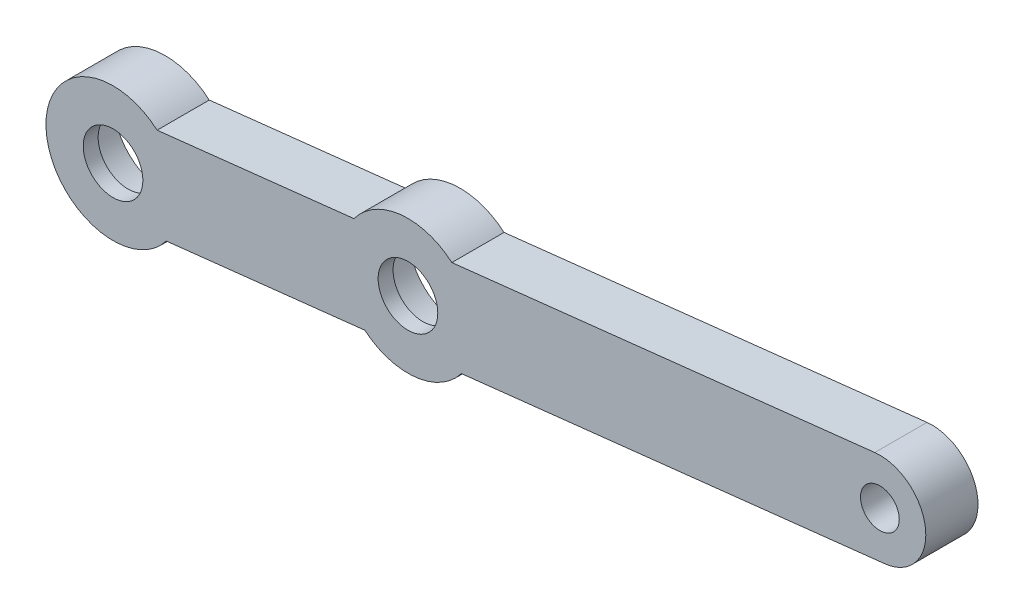
ISO-10303-21;
HEADER;
FILE_DESCRIPTION(('STEP AP214'),'2;1');
FILE_NAME('part.step','',(''),(''),'','','');
FILE_SCHEMA(('AUTOMOTIVE_DESIGN { 1 0 10303 214 1 1 1 1 }'));
ENDSEC;
DATA;
#1=APPLICATION_CONTEXT('core data for automotive mechanical design processes');
#2=APPLICATION_PROTOCOL_DEFINITION('international standard','automotive_design',2000,#1);
#3=PRODUCT_CONTEXT('',#1,'mechanical');
#4=PRODUCT('Part','Part','',(#3));
#5=PRODUCT_RELATED_PRODUCT_CATEGORY('part','',(#4));
#6=PRODUCT_DEFINITION_FORMATION('','',#4);
#7=PRODUCT_DEFINITION_CONTEXT('part definition',#1,'design');
#8=PRODUCT_DEFINITION('design','',#6,#7);
#9=PRODUCT_DEFINITION_SHAPE('','',#8);
#10=(LENGTH_UNIT() NAMED_UNIT(*) SI_UNIT(.MILLI.,.METRE.));
#11=(NAMED_UNIT(*) PLANE_ANGLE_UNIT() SI_UNIT($,.RADIAN.));
#12=(NAMED_UNIT(*) SI_UNIT($,.STERADIAN.) SOLID_ANGLE_UNIT());
#13=UNCERTAINTY_MEASURE_WITH_UNIT(LENGTH_MEASURE(1.E-05),#10,'distance_accuracy_value','');
#14=(GEOMETRIC_REPRESENTATION_CONTEXT(3) GLOBAL_UNCERTAINTY_ASSIGNED_CONTEXT((#13)) GLOBAL_UNIT_ASSIGNED_CONTEXT((#10,
#11,#12)) REPRESENTATION_CONTEXT('',''));
#15=CARTESIAN_POINT('',(0.,0.,0.));
#16=DIRECTION('',(0.,0.,1.));
#17=DIRECTION('',(1.,0.,0.));
#18=AXIS2_PLACEMENT_3D('',#15,#16,#17);
#19=CARTESIAN_POINT('',(3.22612963884084,-57.4284659291081,-1.80560142151046));
#20=DIRECTION('',(0.,0.,1.));
#21=DIRECTION('',(1.,0.,0.));
#22=AXIS2_PLACEMENT_3D('',#19,#20,#21);
#23=PLANE('',#22);
#24=CARTESIAN_POINT('',(3.22612963884084,-57.4284659291081,-1.80560142151046));
#25=DIRECTION('',(0.,0.,1.));
#26=DIRECTION('',(1.,0.,0.));
#27=AXIS2_PLACEMENT_3D('',#24,#25,#26);
#28=CIRCLE('',#27,9.24304799054226);
#29=CARTESIAN_POINT('',(4.24629093724876,-66.6150434790284,-1.80560142151046));
#30=VERTEX_POINT('',#29);
#31=CARTESIAN_POINT('',(2.2059683404333,-48.241888379188,-1.80560142151046));
#32=VERTEX_POINT('',#31);
#33=EDGE_CURVE('E113',#30,#32,#28,.T.);
#34=ORIENTED_EDGE('',*,*,#33,.F.);
#35=DIRECTION('',(0.99389049578886,0.110370659056531,0.));
#36=VECTOR('',#35,1.);
#37=CARTESIAN_POINT('',(-80.9773215388133,-76.0790501437623,-1.80560142151046));
#38=LINE('',#37,#36);
#39=CARTESIAN_POINT('',(-80.9773215388133,-76.0790501437623,-1.80560142151046));
#40=VERTEX_POINT('',#39);
#41=EDGE_CURVE('E58',#40,#30,#38,.T.);
#42=ORIENTED_EDGE('',*,*,#41,.F.);
#43=CARTESIAN_POINT('',(-91.7205093246328,-67.903848849689,-1.80560142151046));
#44=DIRECTION('',(0.,0.,1.));
#45=DIRECTION('',(1.,0.,0.));
#46=AXIS2_PLACEMENT_3D('',#43,#44,#45);
#47=CIRCLE('',#46,13.5);
#48=CARTESIAN_POINT('',(-100.408377438308,-78.23685168717,-1.80560142151046));
#49=VERTEX_POINT('',#48);
#50=EDGE_CURVE('E66',#49,#40,#47,.T.);
#51=ORIENTED_EDGE('',*,*,#50,.F.);
#52=DIRECTION('',(0.99389049578886,0.110370659056531,0.));
#53=VECTOR('',#52,1.);
#54=CARTESIAN_POINT('',(-140.340201625368,-82.6712453870084,-1.80560142151046));
#55=LINE('',#54,#53);
#56=CARTESIAN_POINT('',(-140.340201625368,-82.6712453870084,-1.80560142151046));
#57=VERTEX_POINT('',#56);
#58=EDGE_CURVE('E193',#57,#49,#55,.T.);
#59=ORIENTED_EDGE('',*,*,#58,.F.);
#60=CARTESIAN_POINT('',(-151.057184368627,-74.461721595662,-1.80560142151046));
#61=DIRECTION('',(0.,0.,1.));
#62=DIRECTION('',(1.,0.,0.));
#63=AXIS2_PLACEMENT_3D('',#60,#61,#62);
#64=CIRCLE('',#63,13.5);
#65=CARTESIAN_POINT('',(-142.195346543319,-64.2775264699818,-1.80560142151046));
#66=VERTEX_POINT('',#65);
#67=EDGE_CURVE('E190',#66,#57,#64,.T.);
#68=ORIENTED_EDGE('',*,*,#67,.F.);
#69=DIRECTION('',(-0.99389049578886,-0.110370659056534,0.));
#70=VECTOR('',#69,1.);
#71=CARTESIAN_POINT('',(-102.575568142641,-59.8777851782756,-1.80560142151046));
#72=LINE('',#71,#70);
#73=CARTESIAN_POINT('',(-102.575568142641,-59.8777851782756,-1.80560142151046));
#74=VERTEX_POINT('',#73);
#75=EDGE_CURVE('E187',#74,#66,#72,.T.);
#76=ORIENTED_EDGE('',*,*,#75,.F.);
#77=CARTESIAN_POINT('',(-91.7205093246328,-67.903848849689,-1.80560142151046));
#78=DIRECTION('',(0.,0.,1.));
#79=DIRECTION('',(1.,0.,0.));
#80=AXIS2_PLACEMENT_3D('',#77,#78,#79);
#81=CIRCLE('',#80,13.5);
#82=CARTESIAN_POINT('',(-82.8907760281091,-57.6918064529761,-1.80560142151046));
#83=VERTEX_POINT('',#82);
#84=EDGE_CURVE('E184',#83,#74,#81,.T.);
#85=ORIENTED_EDGE('',*,*,#84,.F.);
#86=DIRECTION('',(-0.99389049578886,-0.110370659056534,0.));
#87=VECTOR('',#86,1.);
#88=CARTESIAN_POINT('',(2.2059683404333,-48.241888379188,-1.80560142151046));
#89=LINE('',#88,#87);
#90=EDGE_CURVE('E181',#32,#83,#89,.T.);
#91=ORIENTED_EDGE('',*,*,#90,.F.);
#92=EDGE_LOOP('',(#34,#42,#51,#59,#68,#76,#85,#91));
#93=FACE_BOUND('',#92,.T.);
#94=CARTESIAN_POINT('',(3.22612963884084,-57.4284659291081,-1.80560142151046));
#95=DIRECTION('',(0.,0.,1.));
#96=DIRECTION('',(1.,0.,0.));
#97=AXIS2_PLACEMENT_3D('',#94,#95,#96);
#98=CIRCLE('',#97,3.9);
#99=CARTESIAN_POINT('',(7.12612963884084,-57.4284659291081,-1.80560142151046));
#100=VERTEX_POINT('',#99);
#101=EDGE_CURVE('E175',#100,#100,#98,.T.);
#102=ORIENTED_EDGE('',*,*,#101,.T.);
#103=EDGE_LOOP('',(#102));
#104=FACE_BOUND('',#103,.T.);
#105=CARTESIAN_POINT('',(-91.7205093246328,-67.903848849689,-1.80560142151046));
#106=DIRECTION('',(0.,0.,1.));
#107=DIRECTION('',(1.,0.,0.));
#108=AXIS2_PLACEMENT_3D('',#105,#106,#107);
#109=CIRCLE('',#108,10.35);
#110=CARTESIAN_POINT('',(-81.3705093246328,-67.903848849689,-1.80560142151046));
#111=VERTEX_POINT('',#110);
#112=EDGE_CURVE('E168',#111,#111,#109,.T.);
#113=ORIENTED_EDGE('',*,*,#112,.T.);
#114=EDGE_LOOP('',(#113));
#115=FACE_BOUND('',#114,.T.);
#116=CARTESIAN_POINT('',(-151.057184368627,-74.461721595662,-1.80560142151046));
#117=DIRECTION('',(0.,0.,1.));
#118=DIRECTION('',(1.,0.,0.));
#119=AXIS2_PLACEMENT_3D('',#116,#117,#118);
#120=CIRCLE('',#119,10.35);
#121=CARTESIAN_POINT('',(-140.707184368627,-74.461721595662,-1.80560142151046));
#122=VERTEX_POINT('',#121);
#123=EDGE_CURVE('E164',#122,#122,#120,.T.);
#124=ORIENTED_EDGE('',*,*,#123,.T.);
#125=EDGE_LOOP('',(#124));
#126=FACE_BOUND('',#125,.T.);
#127=ADVANCED_FACE('F42',(#93,#104,#115,#126),#23,.F.);
#128=CARTESIAN_POINT('',(3.22612963884084,-57.4284659291081,5.69439857848954));
#129=DIRECTION('',(0.,0.,-1.));
#130=DIRECTION('',(-1.,0.,0.));
#131=AXIS2_PLACEMENT_3D('',#128,#129,#130);
#132=CYLINDRICAL_SURFACE('',#131,9.24304799054226);
#133=ORIENTED_EDGE('',*,*,#33,.T.);
#134=DIRECTION('',(0.,0.,-1.));
#135=VECTOR('',#134,1.);
#136=CARTESIAN_POINT('',(2.2059683404333,-48.241888379188,5.69439857848954));
#137=LINE('',#136,#135);
#138=CARTESIAN_POINT('',(2.20596834043328,-48.2418883791878,8.69439857848954));
#139=VERTEX_POINT('',#138);
#140=EDGE_CURVE('E11',#139,#32,#137,.T.);
#141=ORIENTED_EDGE('',*,*,#140,.F.);
#142=CARTESIAN_POINT('',(3.22612963884084,-57.4284659291081,8.69439857848954));
#143=DIRECTION('',(0.,0.,1.));
#144=DIRECTION('',(1.,0.,0.));
#145=AXIS2_PLACEMENT_3D('',#142,#143,#144);
#146=CIRCLE('',#145,9.24304799054226);
#147=CARTESIAN_POINT('',(4.24629093724874,-66.6150434790283,8.69439857848954));
#148=VERTEX_POINT('',#147);
#149=EDGE_CURVE('E111',#148,#139,#146,.T.);
#150=ORIENTED_EDGE('',*,*,#149,.F.);
#151=DIRECTION('',(0.,0.,-1.));
#152=VECTOR('',#151,1.);
#153=CARTESIAN_POINT('',(4.24629093724876,-66.6150434790284,5.69439857848954));
#154=LINE('',#153,#152);
#155=EDGE_CURVE('E200',#148,#30,#154,.T.);
#156=ORIENTED_EDGE('',*,*,#155,.T.);
#157=EDGE_LOOP('',(#133,#141,#150,#156));
#158=FACE_BOUND('',#157,.T.);
#159=ADVANCED_FACE('F44',(#158),#132,.T.);
#160=CARTESIAN_POINT('',(2.2059683404333,-48.241888379188,5.69439857848954));
#161=DIRECTION('',(0.110370659056534,-0.99389049578886,0.));
#162=DIRECTION('',(0.99389049578886,0.110370659056534,0.));
#163=AXIS2_PLACEMENT_3D('',#160,#161,#162);
#164=PLANE('',#163);
#165=ORIENTED_EDGE('',*,*,#90,.T.);
#166=DIRECTION('',(0.,0.,-1.));
#167=VECTOR('',#166,1.);
#168=CARTESIAN_POINT('',(-82.8907760281091,-57.6918064529761,5.69439857848954));
#169=LINE('',#168,#167);
#170=CARTESIAN_POINT('',(-82.8907760281091,-57.6918064529761,8.69439857848954));
#171=VERTEX_POINT('',#170);
#172=EDGE_CURVE('E51',#171,#83,#169,.T.);
#173=ORIENTED_EDGE('',*,*,#172,.F.);
#174=DIRECTION('',(-0.99389049578886,-0.110370659056536,0.));
#175=VECTOR('',#174,1.);
#176=CARTESIAN_POINT('',(2.20596834043328,-48.2418883791878,8.69439857848954));
#177=LINE('',#176,#175);
#178=EDGE_CURVE('E116',#139,#171,#177,.T.);
#179=ORIENTED_EDGE('',*,*,#178,.F.);
#180=ORIENTED_EDGE('',*,*,#140,.T.);
#181=EDGE_LOOP('',(#165,#173,#179,#180));
#182=FACE_BOUND('',#181,.T.);
#183=ADVANCED_FACE('F117',(#182),#164,.F.);
#184=CARTESIAN_POINT('',(-91.7205093246328,-67.903848849689,5.69439857848954));
#185=DIRECTION('',(0.,0.,-1.));
#186=DIRECTION('',(-1.,0.,0.));
#187=AXIS2_PLACEMENT_3D('',#184,#185,#186);
#188=CYLINDRICAL_SURFACE('',#187,13.5);
#189=ORIENTED_EDGE('',*,*,#84,.T.);
#190=DIRECTION('',(0.,0.,-1.));
#191=VECTOR('',#190,1.);
#192=CARTESIAN_POINT('',(-102.575568142641,-59.8777851782756,5.69439857848954));
#193=LINE('',#192,#191);
#194=CARTESIAN_POINT('',(-102.575568142641,-59.8777851782756,8.69439857848954));
#195=VERTEX_POINT('',#194);
#196=EDGE_CURVE('E217',#195,#74,#193,.T.);
#197=ORIENTED_EDGE('',*,*,#196,.F.);
#198=CARTESIAN_POINT('',(-91.7205093246328,-67.903848849689,8.69439857848954));
#199=DIRECTION('',(0.,0.,1.));
#200=DIRECTION('',(1.,0.,0.));
#201=AXIS2_PLACEMENT_3D('',#198,#199,#200);
#202=CIRCLE('',#201,13.5);
#203=EDGE_CURVE('E123',#171,#195,#202,.T.);
#204=ORIENTED_EDGE('',*,*,#203,.F.);
#205=ORIENTED_EDGE('',*,*,#172,.T.);
#206=EDGE_LOOP('',(#189,#197,#204,#205));
#207=FACE_BOUND('',#206,.T.);
#208=ADVANCED_FACE('F223',(#207),#188,.T.);
#209=CARTESIAN_POINT('',(-102.575568142641,-59.8777851782756,5.69439857848954));
#210=DIRECTION('',(0.110370659056534,-0.99389049578886,0.));
#211=DIRECTION('',(0.99389049578886,0.110370659056534,0.));
#212=AXIS2_PLACEMENT_3D('',#209,#210,#211);
#213=PLANE('',#212);
#214=ORIENTED_EDGE('',*,*,#75,.T.);
#215=DIRECTION('',(0.,0.,-1.));
#216=VECTOR('',#215,1.);
#217=CARTESIAN_POINT('',(-142.195346543319,-64.2775264699818,5.69439857848954));
#218=LINE('',#217,#216);
#219=CARTESIAN_POINT('',(-142.195346543319,-64.2775264699818,8.69439857848954));
#220=VERTEX_POINT('',#219);
#221=EDGE_CURVE('E213',#220,#66,#218,.T.);
#222=ORIENTED_EDGE('',*,*,#221,.F.);
#223=DIRECTION('',(-0.99389049578886,-0.110370659056534,0.));
#224=VECTOR('',#223,1.);
#225=CARTESIAN_POINT('',(-102.575568142641,-59.8777851782756,8.69439857848954));
#226=LINE('',#225,#224);
#227=EDGE_CURVE('E142',#195,#220,#226,.T.);
#228=ORIENTED_EDGE('',*,*,#227,.F.);
#229=ORIENTED_EDGE('',*,*,#196,.T.);
#230=EDGE_LOOP('',(#214,#222,#228,#229));
#231=FACE_BOUND('',#230,.T.);
#232=ADVANCED_FACE('F230',(#231),#213,.F.);
#233=CARTESIAN_POINT('',(-151.057184368627,-74.461721595662,5.69439857848954));
#234=DIRECTION('',(0.,0.,-1.));
#235=DIRECTION('',(-1.,0.,0.));
#236=AXIS2_PLACEMENT_3D('',#233,#234,#235);
#237=CYLINDRICAL_SURFACE('',#236,13.5);
#238=ORIENTED_EDGE('',*,*,#67,.T.);
#239=DIRECTION('',(0.,0.,-1.));
#240=VECTOR('',#239,1.);
#241=CARTESIAN_POINT('',(-140.340201625368,-82.6712453870084,5.69439857848954));
#242=LINE('',#241,#240);
#243=CARTESIAN_POINT('',(-140.340201625368,-82.6712453870084,8.69439857848954));
#244=VERTEX_POINT('',#243);
#245=EDGE_CURVE('E209',#244,#57,#242,.T.);
#246=ORIENTED_EDGE('',*,*,#245,.F.);
#247=CARTESIAN_POINT('',(-151.057184368627,-74.461721595662,8.69439857848954));
#248=DIRECTION('',(0.,0.,1.));
#249=DIRECTION('',(1.,0.,0.));
#250=AXIS2_PLACEMENT_3D('',#247,#248,#249);
#251=CIRCLE('',#250,13.5);
#252=EDGE_CURVE('E146',#220,#244,#251,.T.);
#253=ORIENTED_EDGE('',*,*,#252,.F.);
#254=ORIENTED_EDGE('',*,*,#221,.T.);
#255=EDGE_LOOP('',(#238,#246,#253,#254));
#256=FACE_BOUND('',#255,.T.);
#257=ADVANCED_FACE('F234',(#256),#237,.T.);
#258=CARTESIAN_POINT('',(-140.340201625368,-82.6712453870084,5.69439857848954));
#259=DIRECTION('',(-0.110370659056531,0.993890495788861,0.));
#260=DIRECTION('',(-0.993890495788861,-0.110370659056531,0.));
#261=AXIS2_PLACEMENT_3D('',#258,#259,#260);
#262=PLANE('',#261);
#263=ORIENTED_EDGE('',*,*,#58,.T.);
#264=DIRECTION('',(0.,0.,-1.));
#265=VECTOR('',#264,1.);
#266=CARTESIAN_POINT('',(-100.408377438308,-78.23685168717,5.69439857848954));
#267=LINE('',#266,#265);
#268=CARTESIAN_POINT('',(-100.408377438308,-78.23685168717,8.69439857848954));
#269=VERTEX_POINT('',#268);
#270=EDGE_CURVE('E206',#269,#49,#267,.T.);
#271=ORIENTED_EDGE('',*,*,#270,.F.);
#272=DIRECTION('',(0.99389049578886,0.110370659056531,0.));
#273=VECTOR('',#272,1.);
#274=CARTESIAN_POINT('',(-140.340201625368,-82.6712453870084,8.69439857848954));
#275=LINE('',#274,#273);
#276=EDGE_CURVE('E150',#244,#269,#275,.T.);
#277=ORIENTED_EDGE('',*,*,#276,.F.);
#278=ORIENTED_EDGE('',*,*,#245,.T.);
#279=EDGE_LOOP('',(#263,#271,#277,#278));
#280=FACE_BOUND('',#279,.T.);
#281=ADVANCED_FACE('F238',(#280),#262,.F.);
#282=CARTESIAN_POINT('',(-91.7205093246328,-67.903848849689,5.69439857848954));
#283=DIRECTION('',(0.,0.,-1.));
#284=DIRECTION('',(-1.,0.,0.));
#285=AXIS2_PLACEMENT_3D('',#282,#283,#284);
#286=CYLINDRICAL_SURFACE('',#285,13.5);
#287=ORIENTED_EDGE('',*,*,#50,.T.);
#288=DIRECTION('',(0.,0.,-1.));
#289=VECTOR('',#288,1.);
#290=CARTESIAN_POINT('',(-80.9773215388133,-76.0790501437623,5.69439857848954));
#291=LINE('',#290,#289);
#292=CARTESIAN_POINT('',(-80.9773215388133,-76.0790501437623,8.69439857848954));
#293=VERTEX_POINT('',#292);
#294=EDGE_CURVE('E203',#293,#40,#291,.T.);
#295=ORIENTED_EDGE('',*,*,#294,.F.);
#296=CARTESIAN_POINT('',(-91.7205093246328,-67.903848849689,8.69439857848954));
#297=DIRECTION('',(0.,0.,1.));
#298=DIRECTION('',(1.,0.,0.));
#299=AXIS2_PLACEMENT_3D('',#296,#297,#298);
#300=CIRCLE('',#299,13.5);
#301=EDGE_CURVE('E154',#269,#293,#300,.T.);
#302=ORIENTED_EDGE('',*,*,#301,.F.);
#303=ORIENTED_EDGE('',*,*,#270,.T.);
#304=EDGE_LOOP('',(#287,#295,#302,#303));
#305=FACE_BOUND('',#304,.T.);
#306=ADVANCED_FACE('F239',(#305),#286,.T.);
#307=CARTESIAN_POINT('',(-80.9773215388133,-76.0790501437623,5.69439857848954));
#308=DIRECTION('',(-0.110370659056531,0.993890495788861,0.));
#309=DIRECTION('',(-0.993890495788861,-0.110370659056531,0.));
#310=AXIS2_PLACEMENT_3D('',#307,#308,#309);
#311=PLANE('',#310);
#312=ORIENTED_EDGE('',*,*,#41,.T.);
#313=ORIENTED_EDGE('',*,*,#155,.F.);
#314=DIRECTION('',(0.99389049578886,0.110370659056533,0.));
#315=VECTOR('',#314,1.);
#316=CARTESIAN_POINT('',(-80.9773215388133,-76.0790501437623,8.69439857848954));
#317=LINE('',#316,#315);
#318=EDGE_CURVE('E130',#293,#148,#317,.T.);
#319=ORIENTED_EDGE('',*,*,#318,.F.);
#320=ORIENTED_EDGE('',*,*,#294,.T.);
#321=EDGE_LOOP('',(#312,#313,#319,#320));
#322=FACE_BOUND('',#321,.T.);
#323=ADVANCED_FACE('F240',(#322),#311,.F.);
#324=CARTESIAN_POINT('',(3.22612963884084,-57.4284659291081,5.69439857848954));
#325=DIRECTION('',(0.,0.,-1.));
#326=DIRECTION('',(-1.,0.,0.));
#327=AXIS2_PLACEMENT_3D('',#324,#325,#326);
#328=CYLINDRICAL_SURFACE('',#327,3.9);
#329=ORIENTED_EDGE('',*,*,#101,.F.);
#330=EDGE_LOOP('',(#329));
#331=FACE_BOUND('',#330,.T.);
#332=CARTESIAN_POINT('',(3.22612963884084,-57.4284659291081,8.69439857848954));
#333=DIRECTION('',(0.,0.,1.));
#334=DIRECTION('',(1.,0.,0.));
#335=AXIS2_PLACEMENT_3D('',#332,#333,#334);
#336=CIRCLE('',#335,3.9);
#337=CARTESIAN_POINT('',(7.12612963884084,-57.4284659291081,8.69439857848954));
#338=VERTEX_POINT('',#337);
#339=EDGE_CURVE('E132',#338,#338,#336,.T.);
#340=ORIENTED_EDGE('',*,*,#339,.T.);
#341=EDGE_LOOP('',(#340));
#342=FACE_BOUND('',#341,.T.);
#343=ADVANCED_FACE('F242',(#331,#342),#328,.F.);
#344=CARTESIAN_POINT('',(-91.7205093246328,-67.903848849689,5.69439857848954));
#345=DIRECTION('',(0.,0.,-1.));
#346=DIRECTION('',(-1.,0.,0.));
#347=AXIS2_PLACEMENT_3D('',#344,#345,#346);
#348=CYLINDRICAL_SURFACE('',#347,10.35);
#349=CARTESIAN_POINT('',(-91.7205093246328,-67.903848849689,5.69439857848954));
#350=DIRECTION('',(0.,0.,1.));
#351=DIRECTION('',(1.,0.,0.));
#352=AXIS2_PLACEMENT_3D('',#349,#350,#351);
#353=CIRCLE('',#352,10.35);
#354=CARTESIAN_POINT('',(-81.3705093246328,-67.903848849689,5.69439857848954));
#355=VERTEX_POINT('',#354);
#356=EDGE_CURVE('E163',#355,#355,#353,.T.);
#357=ORIENTED_EDGE('',*,*,#356,.T.);
#358=EDGE_LOOP('',(#357));
#359=FACE_BOUND('',#358,.T.);
#360=ORIENTED_EDGE('',*,*,#112,.F.);
#361=EDGE_LOOP('',(#360));
#362=FACE_BOUND('',#361,.T.);
#363=ADVANCED_FACE('F248',(#359,#362),#348,.F.);
#364=CARTESIAN_POINT('',(-151.057184368627,-74.461721595662,5.69439857848954));
#365=DIRECTION('',(0.,0.,-1.));
#366=DIRECTION('',(-1.,0.,0.));
#367=AXIS2_PLACEMENT_3D('',#364,#365,#366);
#368=CYLINDRICAL_SURFACE('',#367,10.35);
#369=CARTESIAN_POINT('',(-151.057184368627,-74.461721595662,5.69439857848954));
#370=DIRECTION('',(0.,0.,1.));
#371=DIRECTION('',(1.,0.,0.));
#372=AXIS2_PLACEMENT_3D('',#369,#370,#371);
#373=CIRCLE('',#372,10.35);
#374=CARTESIAN_POINT('',(-140.707184368627,-74.461721595662,5.69439857848954));
#375=VERTEX_POINT('',#374);
#376=EDGE_CURVE('E159',#375,#375,#373,.T.);
#377=ORIENTED_EDGE('',*,*,#376,.T.);
#378=EDGE_LOOP('',(#377));
#379=FACE_BOUND('',#378,.T.);
#380=ORIENTED_EDGE('',*,*,#123,.F.);
#381=EDGE_LOOP('',(#380));
#382=FACE_BOUND('',#381,.T.);
#383=ADVANCED_FACE('F260',(#379,#382),#368,.F.);
#384=CARTESIAN_POINT('',(3.22612963884084,-57.4284659291081,5.69439857848954));
#385=DIRECTION('',(0.,0.,1.));
#386=DIRECTION('',(1.,0.,0.));
#387=AXIS2_PLACEMENT_3D('',#384,#385,#386);
#388=PLANE('',#387);
#389=CARTESIAN_POINT('',(-91.7205093245982,-67.9038488494878,5.69439857848954));
#390=DIRECTION('',(0.,0.,1.));
#391=DIRECTION('',(1.,0.,0.));
#392=AXIS2_PLACEMENT_3D('',#389,#390,#391);
#393=CIRCLE('',#392,6.00000000000001);
#394=CARTESIAN_POINT('',(-85.7205093245982,-67.9038488494878,5.69439857848954));
#395=VERTEX_POINT('',#394);
#396=EDGE_CURVE('E293',#395,#395,#393,.T.);
#397=ORIENTED_EDGE('',*,*,#396,.T.);
#398=EDGE_LOOP('',(#397));
#399=FACE_BOUND('',#398,.T.);
#400=ORIENTED_EDGE('',*,*,#356,.F.);
#401=EDGE_LOOP('',(#400));
#402=FACE_BOUND('',#401,.T.);
#403=ADVANCED_FACE('F264',(#399,#402),#388,.F.);
#404=CARTESIAN_POINT('',(-151.057184368627,-74.461721595662,5.69439857848954));
#405=DIRECTION('',(0.,0.,1.));
#406=DIRECTION('',(1.,0.,0.));
#407=AXIS2_PLACEMENT_3D('',#404,#405,#406);
#408=CIRCLE('',#407,6.00000000000001);
#409=CARTESIAN_POINT('',(-145.057184368627,-74.461721595662,5.69439857848954));
#410=VERTEX_POINT('',#409);
#411=EDGE_CURVE('E288',#410,#410,#408,.T.);
#412=ORIENTED_EDGE('',*,*,#411,.T.);
#413=EDGE_LOOP('',(#412));
#414=FACE_BOUND('',#413,.T.);
#415=ORIENTED_EDGE('',*,*,#376,.F.);
#416=EDGE_LOOP('',(#415));
#417=FACE_BOUND('',#416,.T.);
#418=ADVANCED_FACE('F268',(#414,#417),#388,.F.);
#419=CARTESIAN_POINT('',(3.22612963884084,-57.4284659291081,8.69439857848954));
#420=DIRECTION('',(0.,0.,1.));
#421=DIRECTION('',(1.,0.,0.));
#422=AXIS2_PLACEMENT_3D('',#419,#420,#421);
#423=PLANE('',#422);
#424=CARTESIAN_POINT('',(-91.7205093245982,-67.9038488494878,8.69439857848954));
#425=DIRECTION('',(0.,0.,1.));
#426=DIRECTION('',(1.,0.,0.));
#427=AXIS2_PLACEMENT_3D('',#424,#425,#426);
#428=CIRCLE('',#427,6.00000000000001);
#429=CARTESIAN_POINT('',(-85.7205093245982,-67.9038488494878,8.69439857848954));
#430=VERTEX_POINT('',#429);
#431=EDGE_CURVE('E136',#430,#430,#428,.T.);
#432=ORIENTED_EDGE('',*,*,#431,.F.);
#433=EDGE_LOOP('',(#432));
#434=FACE_BOUND('',#433,.T.);
#435=ORIENTED_EDGE('',*,*,#149,.T.);
#436=ORIENTED_EDGE('',*,*,#178,.T.);
#437=ORIENTED_EDGE('',*,*,#203,.T.);
#438=ORIENTED_EDGE('',*,*,#227,.T.);
#439=ORIENTED_EDGE('',*,*,#252,.T.);
#440=ORIENTED_EDGE('',*,*,#276,.T.);
#441=ORIENTED_EDGE('',*,*,#301,.T.);
#442=ORIENTED_EDGE('',*,*,#318,.T.);
#443=EDGE_LOOP('',(#435,#436,#437,#438,#439,#440,#441,#442));
#444=FACE_BOUND('',#443,.T.);
#445=ORIENTED_EDGE('',*,*,#339,.F.);
#446=EDGE_LOOP('',(#445));
#447=FACE_BOUND('',#446,.T.);
#448=CARTESIAN_POINT('',(-151.057184368627,-74.461721595662,8.69439857848954));
#449=DIRECTION('',(0.,0.,1.));
#450=DIRECTION('',(1.,0.,0.));
#451=AXIS2_PLACEMENT_3D('',#448,#449,#450);
#452=CIRCLE('',#451,6.00000000000001);
#453=CARTESIAN_POINT('',(-145.057184368627,-74.461721595662,8.69439857848954));
#454=VERTEX_POINT('',#453);
#455=EDGE_CURVE('E285',#454,#454,#452,.T.);
#456=ORIENTED_EDGE('',*,*,#455,.F.);
#457=EDGE_LOOP('',(#456));
#458=FACE_BOUND('',#457,.T.);
#459=ADVANCED_FACE('F126',(#434,#444,#447,#458),#423,.T.);
#460=CARTESIAN_POINT('',(-91.7205093245982,-67.9038488494878,8.69439857848954));
#461=DIRECTION('',(0.,0.,-1.));
#462=DIRECTION('',(-1.,0.,0.));
#463=AXIS2_PLACEMENT_3D('',#460,#461,#462);
#464=CYLINDRICAL_SURFACE('',#463,6.00000000000001);
#465=ORIENTED_EDGE('',*,*,#431,.T.);
#466=EDGE_LOOP('',(#465));
#467=FACE_BOUND('',#466,.T.);
#468=ORIENTED_EDGE('',*,*,#396,.F.);
#469=EDGE_LOOP('',(#468));
#470=FACE_BOUND('',#469,.T.);
#471=ADVANCED_FACE('F272',(#467,#470),#464,.F.);
#472=CARTESIAN_POINT('',(-151.057184368627,-74.461721595662,8.69439857848954));
#473=DIRECTION('',(0.,0.,-1.));
#474=DIRECTION('',(-1.,0.,0.));
#475=AXIS2_PLACEMENT_3D('',#472,#473,#474);
#476=CYLINDRICAL_SURFACE('',#475,6.00000000000001);
#477=ORIENTED_EDGE('',*,*,#455,.T.);
#478=EDGE_LOOP('',(#477));
#479=FACE_BOUND('',#478,.T.);
#480=ORIENTED_EDGE('',*,*,#411,.F.);
#481=EDGE_LOOP('',(#480));
#482=FACE_BOUND('',#481,.T.);
#483=ADVANCED_FACE('F276',(#479,#482),#476,.F.);
#484=CLOSED_SHELL('',(#127,#159,#183,#208,#232,#257,#281,#306,#323,#343,#363,#383,#403,#418,
#459,#471,#483));
#485=MANIFOLD_SOLID_BREP('B2',#484);
#486=ADVANCED_BREP_SHAPE_REPRESENTATION('',(#18,#485),#14);
#487=SHAPE_DEFINITION_REPRESENTATION(#9,#486);
ENDSEC;
END-ISO-10303-21;
